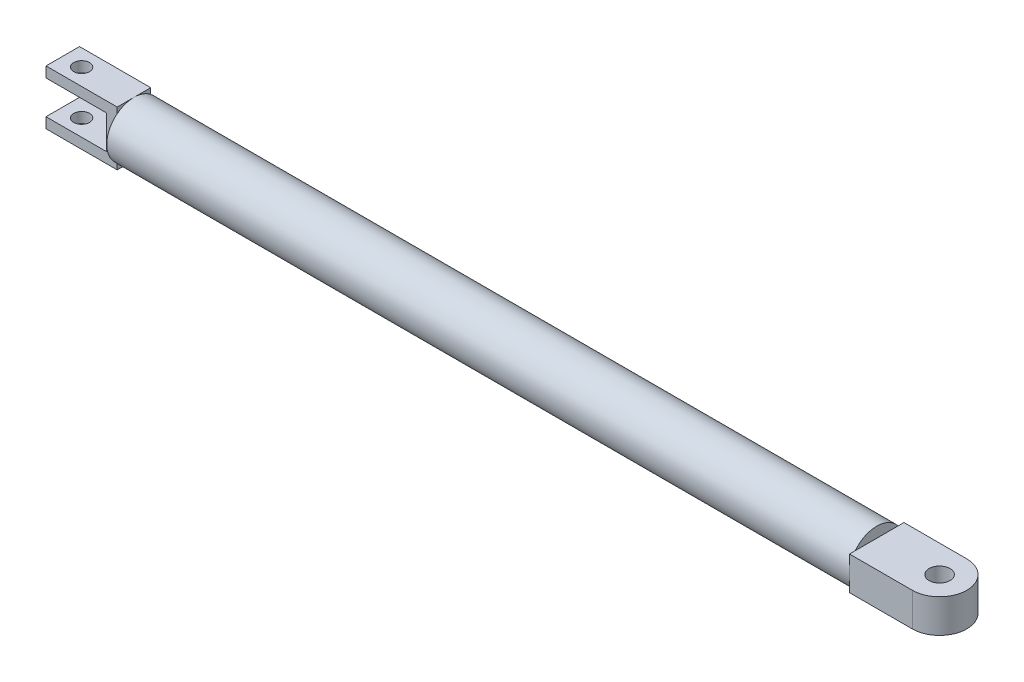
ISO-10303-21;
HEADER;
FILE_DESCRIPTION(('STEP AP214'),'2;1');
FILE_NAME('part.step','',(''),(''),'','','');
FILE_SCHEMA(('AUTOMOTIVE_DESIGN { 1 0 10303 214 1 1 1 1 }'));
ENDSEC;
DATA;
#1=APPLICATION_CONTEXT('core data for automotive mechanical design processes');
#2=APPLICATION_PROTOCOL_DEFINITION('international standard','automotive_design',2000,#1);
#3=PRODUCT_CONTEXT('',#1,'mechanical');
#4=PRODUCT('Part','Part','',(#3));
#5=PRODUCT_RELATED_PRODUCT_CATEGORY('part','',(#4));
#6=PRODUCT_DEFINITION_FORMATION('','',#4);
#7=PRODUCT_DEFINITION_CONTEXT('part definition',#1,'design');
#8=PRODUCT_DEFINITION('design','',#6,#7);
#9=PRODUCT_DEFINITION_SHAPE('','',#8);
#10=(LENGTH_UNIT() NAMED_UNIT(*) SI_UNIT(.MILLI.,.METRE.));
#11=(NAMED_UNIT(*) PLANE_ANGLE_UNIT() SI_UNIT($,.RADIAN.));
#12=(NAMED_UNIT(*) SI_UNIT($,.STERADIAN.) SOLID_ANGLE_UNIT());
#13=UNCERTAINTY_MEASURE_WITH_UNIT(LENGTH_MEASURE(1.E-05),#10,'distance_accuracy_value','');
#14=(GEOMETRIC_REPRESENTATION_CONTEXT(3) GLOBAL_UNCERTAINTY_ASSIGNED_CONTEXT((#13)) GLOBAL_UNIT_ASSIGNED_CONTEXT((#10,
#11,#12)) REPRESENTATION_CONTEXT('',''));
#15=CARTESIAN_POINT('',(0.,0.,0.));
#16=DIRECTION('',(0.,0.,1.));
#17=DIRECTION('',(1.,0.,0.));
#18=AXIS2_PLACEMENT_3D('',#15,#16,#17);
#19=CARTESIAN_POINT('',(0.,0.,0.));
#20=DIRECTION('',(1.,0.,0.));
#21=DIRECTION('',(0.,0.,-1.));
#22=AXIS2_PLACEMENT_3D('',#19,#20,#21);
#23=PLANE('',#22);
#24=DIRECTION('',(0.,-1.,0.));
#25=VECTOR('',#24,1.);
#26=CARTESIAN_POINT('',(0.,0.,-5.08));
#27=LINE('',#26,#25);
#28=CARTESIAN_POINT('',(0.,6.50681373638434,-5.08));
#29=VERTEX_POINT('',#28);
#30=CARTESIAN_POINT('',(0.,-6.50681373638434,-5.08));
#31=VERTEX_POINT('',#30);
#32=EDGE_CURVE('E44',#29,#31,#27,.T.);
#33=ORIENTED_EDGE('',*,*,#32,.F.);
#34=CARTESIAN_POINT('',(0.,0.,0.));
#35=DIRECTION('',(1.,0.,0.));
#36=DIRECTION('',(0.,0.,-1.));
#37=AXIS2_PLACEMENT_3D('',#34,#35,#36);
#38=CIRCLE('',#37,8.255);
#39=EDGE_CURVE('E276',#31,#29,#38,.T.);
#40=ORIENTED_EDGE('',*,*,#39,.F.);
#41=EDGE_LOOP('',(#33,#40));
#42=FACE_BOUND('',#41,.T.);
#43=ADVANCED_FACE('F35',(#42),#23,.F.);
#44=CARTESIAN_POINT('',(225.171,0.,0.));
#45=DIRECTION('',(1.,0.,0.));
#46=DIRECTION('',(0.,0.,-1.));
#47=AXIS2_PLACEMENT_3D('',#44,#45,#46);
#48=PLANE('',#47);
#49=CARTESIAN_POINT('',(225.171,0.,0.));
#50=DIRECTION('',(1.,0.,0.));
#51=DIRECTION('',(0.,0.,-1.));
#52=AXIS2_PLACEMENT_3D('',#49,#50,#51);
#53=CIRCLE('',#52,8.255);
#54=CARTESIAN_POINT('',(225.171,-5.08,6.50681373638434));
#55=VERTEX_POINT('',#54);
#56=CARTESIAN_POINT('',(225.171,-5.08,-6.50681373638434));
#57=VERTEX_POINT('',#56);
#58=EDGE_CURVE('E294',#55,#57,#53,.T.);
#59=ORIENTED_EDGE('',*,*,#58,.T.);
#60=DIRECTION('',(0.,0.,1.));
#61=VECTOR('',#60,1.);
#62=CARTESIAN_POINT('',(225.171,-5.08,8.255));
#63=LINE('',#62,#61);
#64=EDGE_CURVE('E272',#57,#55,#63,.T.);
#65=ORIENTED_EDGE('',*,*,#64,.T.);
#66=EDGE_LOOP('',(#59,#65));
#67=FACE_BOUND('',#66,.T.);
#68=ADVANCED_FACE('F362',(#67),#48,.T.);
#69=CARTESIAN_POINT('',(225.171,0.,0.));
#70=DIRECTION('',(-1.,0.,0.));
#71=DIRECTION('',(0.,0.,1.));
#72=AXIS2_PLACEMENT_3D('',#69,#70,#71);
#73=CYLINDRICAL_SURFACE('',#72,8.255);
#74=CARTESIAN_POINT('',(225.171,0.,-8.255));
#75=VERTEX_POINT('',#74);
#76=CARTESIAN_POINT('',(225.171,5.08,-6.50681373638434));
#77=VERTEX_POINT('',#76);
#78=EDGE_CURVE('E285',#75,#77,#53,.T.);
#79=ORIENTED_EDGE('',*,*,#78,.F.);
#80=EDGE_CURVE('E287',#57,#75,#53,.T.);
#81=ORIENTED_EDGE('',*,*,#80,.F.);
#82=ORIENTED_EDGE('',*,*,#58,.F.);
#83=CARTESIAN_POINT('',(225.171,0.,8.255));
#84=VERTEX_POINT('',#83);
#85=EDGE_CURVE('E356',#84,#55,#53,.T.);
#86=ORIENTED_EDGE('',*,*,#85,.F.);
#87=CARTESIAN_POINT('',(225.171,5.08,6.50681373638434));
#88=VERTEX_POINT('',#87);
#89=EDGE_CURVE('E331',#88,#84,#53,.T.);
#90=ORIENTED_EDGE('',*,*,#89,.F.);
#91=EDGE_CURVE('E286',#77,#88,#53,.T.);
#92=ORIENTED_EDGE('',*,*,#91,.F.);
#93=EDGE_LOOP('',(#79,#81,#82,#86,#90,#92));
#94=FACE_BOUND('',#93,.T.);
#95=CARTESIAN_POINT('',(0.,8.255,0.));
#96=VERTEX_POINT('',#95);
#97=EDGE_CURVE('E288',#29,#96,#38,.T.);
#98=ORIENTED_EDGE('',*,*,#97,.T.);
#99=CARTESIAN_POINT('',(0.,6.50681373638434,5.08));
#100=VERTEX_POINT('',#99);
#101=EDGE_CURVE('E289',#96,#100,#38,.T.);
#102=ORIENTED_EDGE('',*,*,#101,.T.);
#103=CARTESIAN_POINT('',(0.,-6.50681373638434,5.08));
#104=VERTEX_POINT('',#103);
#105=EDGE_CURVE('E295',#100,#104,#38,.T.);
#106=ORIENTED_EDGE('',*,*,#105,.T.);
#107=CARTESIAN_POINT('',(0.,-8.255,0.));
#108=VERTEX_POINT('',#107);
#109=EDGE_CURVE('E54',#104,#108,#38,.T.);
#110=ORIENTED_EDGE('',*,*,#109,.T.);
#111=EDGE_CURVE('E296',#108,#31,#38,.T.);
#112=ORIENTED_EDGE('',*,*,#111,.T.);
#113=ORIENTED_EDGE('',*,*,#39,.T.);
#114=EDGE_LOOP('',(#98,#102,#106,#110,#112,#113));
#115=FACE_BOUND('',#114,.T.);
#116=ADVANCED_FACE('F37',(#94,#115),#73,.T.);
#117=DIRECTION('',(0.,0.,1.));
#118=VECTOR('',#117,1.);
#119=CARTESIAN_POINT('',(225.171,5.08,8.255));
#120=LINE('',#119,#118);
#121=EDGE_CURVE('E255',#77,#88,#120,.T.);
#122=ORIENTED_EDGE('',*,*,#121,.F.);
#123=ORIENTED_EDGE('',*,*,#91,.T.);
#124=EDGE_LOOP('',(#122,#123));
#125=FACE_BOUND('',#124,.T.);
#126=ADVANCED_FACE('F352',(#125),#48,.T.);
#127=ORIENTED_EDGE('',*,*,#105,.F.);
#128=DIRECTION('',(0.,-1.,0.));
#129=VECTOR('',#128,1.);
#130=CARTESIAN_POINT('',(0.,0.,5.08));
#131=LINE('',#130,#129);
#132=EDGE_CURVE('E11',#100,#104,#131,.T.);
#133=ORIENTED_EDGE('',*,*,#132,.T.);
#134=EDGE_LOOP('',(#127,#133));
#135=FACE_BOUND('',#134,.T.);
#136=ADVANCED_FACE('F375',(#135),#23,.F.);
#137=CARTESIAN_POINT('',(225.171,-5.08,8.255));
#138=DIRECTION('',(-1.,0.,0.));
#139=DIRECTION('',(0.,0.,1.));
#140=AXIS2_PLACEMENT_3D('',#137,#138,#139);
#141=PLANE('',#140);
#142=CARTESIAN_POINT('',(225.171,5.08,8.255));
#143=VERTEX_POINT('',#142);
#144=EDGE_CURVE('E250',#88,#143,#120,.T.);
#145=ORIENTED_EDGE('',*,*,#144,.F.);
#146=ORIENTED_EDGE('',*,*,#89,.T.);
#147=DIRECTION('',(0.,1.,0.));
#148=VECTOR('',#147,1.);
#149=CARTESIAN_POINT('',(225.171,-5.08,8.255));
#150=LINE('',#149,#148);
#151=EDGE_CURVE('E277',#84,#143,#150,.T.);
#152=ORIENTED_EDGE('',*,*,#151,.T.);
#153=EDGE_LOOP('',(#145,#146,#152));
#154=FACE_BOUND('',#153,.T.);
#155=ADVANCED_FACE('F330',(#154),#141,.T.);
#156=CARTESIAN_POINT('',(225.171,-5.08,8.255));
#157=VERTEX_POINT('',#156);
#158=EDGE_CURVE('E273',#157,#84,#150,.T.);
#159=ORIENTED_EDGE('',*,*,#158,.T.);
#160=ORIENTED_EDGE('',*,*,#85,.T.);
#161=EDGE_CURVE('E267',#55,#157,#63,.T.);
#162=ORIENTED_EDGE('',*,*,#161,.T.);
#163=EDGE_LOOP('',(#159,#160,#162));
#164=FACE_BOUND('',#163,.T.);
#165=ADVANCED_FACE('F368',(#164),#141,.T.);
#166=DIRECTION('',(0.,1.,0.));
#167=VECTOR('',#166,1.);
#168=CARTESIAN_POINT('',(225.171,-5.08,-8.255));
#169=LINE('',#168,#167);
#170=CARTESIAN_POINT('',(225.171,5.08,-8.255));
#171=VERTEX_POINT('',#170);
#172=EDGE_CURVE('E281',#75,#171,#169,.T.);
#173=ORIENTED_EDGE('',*,*,#172,.F.);
#174=ORIENTED_EDGE('',*,*,#78,.T.);
#175=EDGE_CURVE('E251',#171,#77,#120,.T.);
#176=ORIENTED_EDGE('',*,*,#175,.F.);
#177=EDGE_LOOP('',(#173,#174,#176));
#178=FACE_BOUND('',#177,.T.);
#179=ADVANCED_FACE('F348',(#178),#141,.T.);
#180=CARTESIAN_POINT('',(225.171,-5.08,8.255));
#181=DIRECTION('',(0.,0.,1.));
#182=DIRECTION('',(1.,0.,0.));
#183=AXIS2_PLACEMENT_3D('',#180,#181,#182);
#184=PLANE('',#183);
#185=DIRECTION('',(0.,1.,0.));
#186=VECTOR('',#185,1.);
#187=CARTESIAN_POINT('',(244.221,-5.08,8.255));
#188=LINE('',#187,#186);
#189=CARTESIAN_POINT('',(244.221,-5.08,8.255));
#190=VERTEX_POINT('',#189);
#191=CARTESIAN_POINT('',(244.221,5.08,8.255));
#192=VERTEX_POINT('',#191);
#193=EDGE_CURVE('E271',#190,#192,#188,.T.);
#194=ORIENTED_EDGE('',*,*,#193,.T.);
#195=DIRECTION('',(1.,0.,0.));
#196=VECTOR('',#195,1.);
#197=CARTESIAN_POINT('',(225.171,5.08,8.255));
#198=LINE('',#197,#196);
#199=EDGE_CURVE('E241',#143,#192,#198,.T.);
#200=ORIENTED_EDGE('',*,*,#199,.F.);
#201=ORIENTED_EDGE('',*,*,#151,.F.);
#202=ORIENTED_EDGE('',*,*,#158,.F.);
#203=DIRECTION('',(1.,0.,0.));
#204=VECTOR('',#203,1.);
#205=CARTESIAN_POINT('',(225.171,-5.08,8.255));
#206=LINE('',#205,#204);
#207=EDGE_CURVE('E258',#157,#190,#206,.T.);
#208=ORIENTED_EDGE('',*,*,#207,.T.);
#209=EDGE_LOOP('',(#194,#200,#201,#202,#208));
#210=FACE_BOUND('',#209,.T.);
#211=ADVANCED_FACE('F334',(#210),#184,.T.);
#212=CARTESIAN_POINT('',(225.171,-5.08,-8.255));
#213=VERTEX_POINT('',#212);
#214=EDGE_CURVE('E268',#213,#57,#63,.T.);
#215=ORIENTED_EDGE('',*,*,#214,.T.);
#216=ORIENTED_EDGE('',*,*,#80,.T.);
#217=EDGE_CURVE('E278',#213,#75,#169,.T.);
#218=ORIENTED_EDGE('',*,*,#217,.F.);
#219=EDGE_LOOP('',(#215,#216,#218));
#220=FACE_BOUND('',#219,.T.);
#221=ADVANCED_FACE('F364',(#220),#141,.T.);
#222=CARTESIAN_POINT('',(225.171,-5.08,-8.255));
#223=DIRECTION('',(0.,0.,-1.));
#224=DIRECTION('',(-1.,0.,0.));
#225=AXIS2_PLACEMENT_3D('',#222,#223,#224);
#226=PLANE('',#225);
#227=ORIENTED_EDGE('',*,*,#217,.T.);
#228=ORIENTED_EDGE('',*,*,#172,.T.);
#229=DIRECTION('',(-1.,0.,0.));
#230=VECTOR('',#229,1.);
#231=CARTESIAN_POINT('',(225.171,5.08,-8.255));
#232=LINE('',#231,#230);
#233=CARTESIAN_POINT('',(244.221,5.08,-8.255));
#234=VERTEX_POINT('',#233);
#235=EDGE_CURVE('E247',#234,#171,#232,.T.);
#236=ORIENTED_EDGE('',*,*,#235,.F.);
#237=DIRECTION('',(0.,1.,0.));
#238=VECTOR('',#237,1.);
#239=CARTESIAN_POINT('',(244.221,-5.08,-8.255));
#240=LINE('',#239,#238);
#241=CARTESIAN_POINT('',(244.221,-5.08,-8.255));
#242=VERTEX_POINT('',#241);
#243=EDGE_CURVE('E282',#242,#234,#240,.T.);
#244=ORIENTED_EDGE('',*,*,#243,.F.);
#245=DIRECTION('',(-1.,0.,0.));
#246=VECTOR('',#245,1.);
#247=CARTESIAN_POINT('',(225.171,-5.08,-8.255));
#248=LINE('',#247,#246);
#249=EDGE_CURVE('E264',#242,#213,#248,.T.);
#250=ORIENTED_EDGE('',*,*,#249,.T.);
#251=EDGE_LOOP('',(#227,#228,#236,#244,#250));
#252=FACE_BOUND('',#251,.T.);
#253=ADVANCED_FACE('F343',(#252),#226,.T.);
#254=CARTESIAN_POINT('',(244.221,-5.08,0.));
#255=DIRECTION('',(0.,1.,0.));
#256=DIRECTION('',(0.,0.,1.));
#257=AXIS2_PLACEMENT_3D('',#254,#255,#256);
#258=CYLINDRICAL_SURFACE('',#257,8.255);
#259=ORIENTED_EDGE('',*,*,#243,.T.);
#260=CARTESIAN_POINT('',(244.221,5.08,0.));
#261=DIRECTION('',(0.,1.,0.));
#262=DIRECTION('',(0.,0.,-1.));
#263=AXIS2_PLACEMENT_3D('',#260,#261,#262);
#264=CIRCLE('',#263,8.255);
#265=EDGE_CURVE('E244',#192,#234,#264,.T.);
#266=ORIENTED_EDGE('',*,*,#265,.F.);
#267=ORIENTED_EDGE('',*,*,#193,.F.);
#268=CARTESIAN_POINT('',(244.221,-5.08,0.));
#269=DIRECTION('',(0.,1.,0.));
#270=DIRECTION('',(0.,0.,-1.));
#271=AXIS2_PLACEMENT_3D('',#268,#269,#270);
#272=CIRCLE('',#271,8.255);
#273=EDGE_CURVE('E261',#190,#242,#272,.T.);
#274=ORIENTED_EDGE('',*,*,#273,.T.);
#275=EDGE_LOOP('',(#259,#266,#267,#274));
#276=FACE_BOUND('',#275,.T.);
#277=ADVANCED_FACE('F339',(#276),#258,.T.);
#278=CARTESIAN_POINT('',(244.221,-5.08,0.));
#279=DIRECTION('',(0.,-1.,0.));
#280=DIRECTION('',(0.,0.,-1.));
#281=AXIS2_PLACEMENT_3D('',#278,#279,#280);
#282=PLANE('',#281);
#283=CARTESIAN_POINT('',(244.221,-5.08,0.));
#284=DIRECTION('',(0.,1.,0.));
#285=DIRECTION('',(0.,0.,1.));
#286=AXIS2_PLACEMENT_3D('',#283,#284,#285);
#287=CIRCLE('',#286,3.17499999999997);
#288=CARTESIAN_POINT('',(244.221,-5.08,3.17499999999997));
#289=VERTEX_POINT('',#288);
#290=EDGE_CURVE('E254',#289,#289,#287,.T.);
#291=ORIENTED_EDGE('',*,*,#290,.T.);
#292=EDGE_LOOP('',(#291));
#293=FACE_BOUND('',#292,.T.);
#294=ORIENTED_EDGE('',*,*,#207,.F.);
#295=ORIENTED_EDGE('',*,*,#161,.F.);
#296=ORIENTED_EDGE('',*,*,#64,.F.);
#297=ORIENTED_EDGE('',*,*,#214,.F.);
#298=ORIENTED_EDGE('',*,*,#249,.F.);
#299=ORIENTED_EDGE('',*,*,#273,.F.);
#300=EDGE_LOOP('',(#294,#295,#296,#297,#298,#299));
#301=FACE_BOUND('',#300,.T.);
#302=ADVANCED_FACE('F367',(#293,#301),#282,.T.);
#303=CARTESIAN_POINT('',(244.221,-5.08,0.));
#304=DIRECTION('',(0.,1.,0.));
#305=DIRECTION('',(0.,0.,1.));
#306=AXIS2_PLACEMENT_3D('',#303,#304,#305);
#307=CYLINDRICAL_SURFACE('',#306,3.17499999999997);
#308=ORIENTED_EDGE('',*,*,#290,.F.);
#309=EDGE_LOOP('',(#308));
#310=FACE_BOUND('',#309,.T.);
#311=CARTESIAN_POINT('',(244.221,5.08,0.));
#312=DIRECTION('',(0.,1.,0.));
#313=DIRECTION('',(0.,0.,1.));
#314=AXIS2_PLACEMENT_3D('',#311,#312,#313);
#315=CIRCLE('',#314,3.17499999999997);
#316=CARTESIAN_POINT('',(244.221,5.08,3.17499999999997));
#317=VERTEX_POINT('',#316);
#318=EDGE_CURVE('E223',#317,#317,#315,.T.);
#319=ORIENTED_EDGE('',*,*,#318,.T.);
#320=EDGE_LOOP('',(#319));
#321=FACE_BOUND('',#320,.T.);
#322=ADVANCED_FACE('F583',(#310,#321),#307,.F.);
#323=CARTESIAN_POINT('',(244.221,5.08,0.));
#324=DIRECTION('',(0.,-1.,0.));
#325=DIRECTION('',(0.,0.,-1.));
#326=AXIS2_PLACEMENT_3D('',#323,#324,#325);
#327=PLANE('',#326);
#328=ORIENTED_EDGE('',*,*,#199,.T.);
#329=ORIENTED_EDGE('',*,*,#265,.T.);
#330=ORIENTED_EDGE('',*,*,#235,.T.);
#331=ORIENTED_EDGE('',*,*,#175,.T.);
#332=ORIENTED_EDGE('',*,*,#121,.T.);
#333=ORIENTED_EDGE('',*,*,#144,.T.);
#334=EDGE_LOOP('',(#328,#329,#330,#331,#332,#333));
#335=FACE_BOUND('',#334,.T.);
#336=ORIENTED_EDGE('',*,*,#318,.F.);
#337=EDGE_LOOP('',(#336));
#338=FACE_BOUND('',#337,.T.);
#339=ADVANCED_FACE('F325',(#335,#338),#327,.F.);
#340=CARTESIAN_POINT('',(0.,0.,-5.08));
#341=DIRECTION('',(-1.,0.,0.));
#342=DIRECTION('',(0.,0.,1.));
#343=AXIS2_PLACEMENT_3D('',#340,#341,#342);
#344=PLANE('',#343);
#345=ORIENTED_EDGE('',*,*,#97,.F.);
#346=CARTESIAN_POINT('',(0.,8.255,-5.08));
#347=VERTEX_POINT('',#346);
#348=EDGE_CURVE('E214',#347,#29,#27,.T.);
#349=ORIENTED_EDGE('',*,*,#348,.F.);
#350=DIRECTION('',(0.,0.,1.));
#351=VECTOR('',#350,1.);
#352=CARTESIAN_POINT('',(0.,8.255,-5.08));
#353=LINE('',#352,#351);
#354=EDGE_CURVE('E228',#347,#96,#353,.T.);
#355=ORIENTED_EDGE('',*,*,#354,.T.);
#356=EDGE_LOOP('',(#345,#349,#355));
#357=FACE_BOUND('',#356,.T.);
#358=ADVANCED_FACE('F446',(#357),#344,.F.);
#359=ORIENTED_EDGE('',*,*,#101,.F.);
#360=CARTESIAN_POINT('',(0.,8.255,5.08));
#361=VERTEX_POINT('',#360);
#362=EDGE_CURVE('E231',#96,#361,#353,.T.);
#363=ORIENTED_EDGE('',*,*,#362,.T.);
#364=EDGE_CURVE('E46',#361,#100,#131,.T.);
#365=ORIENTED_EDGE('',*,*,#364,.T.);
#366=EDGE_LOOP('',(#359,#363,#365));
#367=FACE_BOUND('',#366,.T.);
#368=ADVANCED_FACE('F451',(#367),#344,.F.);
#369=ORIENTED_EDGE('',*,*,#109,.F.);
#370=CARTESIAN_POINT('',(0.,-8.255,5.08));
#371=VERTEX_POINT('',#370);
#372=EDGE_CURVE('E47',#104,#371,#131,.T.);
#373=ORIENTED_EDGE('',*,*,#372,.T.);
#374=DIRECTION('',(0.,0.,1.));
#375=VECTOR('',#374,1.);
#376=CARTESIAN_POINT('',(0.,-8.255,-5.08));
#377=LINE('',#376,#375);
#378=EDGE_CURVE('E235',#108,#371,#377,.T.);
#379=ORIENTED_EDGE('',*,*,#378,.F.);
#380=EDGE_LOOP('',(#369,#373,#379));
#381=FACE_BOUND('',#380,.T.);
#382=ADVANCED_FACE('F302',(#381),#344,.F.);
#383=CARTESIAN_POINT('',(-3.175,0.,-5.08));
#384=DIRECTION('',(-1.,0.,0.));
#385=DIRECTION('',(0.,-1.,0.));
#386=AXIS2_PLACEMENT_3D('',#383,#384,#385);
#387=PLANE('',#386);
#388=DIRECTION('',(0.,0.,1.));
#389=VECTOR('',#388,1.);
#390=CARTESIAN_POINT('',(-3.175,-5.07999999999999,-5.08));
#391=LINE('',#390,#389);
#392=CARTESIAN_POINT('',(-3.175,-5.07999999999999,-5.08));
#393=VERTEX_POINT('',#392);
#394=CARTESIAN_POINT('',(-3.175,-5.07999999999999,5.08));
#395=VERTEX_POINT('',#394);
#396=EDGE_CURVE('E162',#393,#395,#391,.T.);
#397=ORIENTED_EDGE('',*,*,#396,.T.);
#398=DIRECTION('',(0.,-1.,0.));
#399=VECTOR('',#398,1.);
#400=CARTESIAN_POINT('',(-3.175,0.,5.08));
#401=LINE('',#400,#399);
#402=CARTESIAN_POINT('',(-3.175,5.08,5.08));
#403=VERTEX_POINT('',#402);
#404=EDGE_CURVE('E166',#403,#395,#401,.T.);
#405=ORIENTED_EDGE('',*,*,#404,.F.);
#406=DIRECTION('',(0.,0.,1.));
#407=VECTOR('',#406,1.);
#408=CARTESIAN_POINT('',(-3.175,5.08,-5.08));
#409=LINE('',#408,#407);
#410=CARTESIAN_POINT('',(-3.175,5.08,-5.08));
#411=VERTEX_POINT('',#410);
#412=EDGE_CURVE('E221',#411,#403,#409,.T.);
#413=ORIENTED_EDGE('',*,*,#412,.F.);
#414=DIRECTION('',(0.,-1.,0.));
#415=VECTOR('',#414,1.);
#416=CARTESIAN_POINT('',(-3.175,0.,-5.08));
#417=LINE('',#416,#415);
#418=EDGE_CURVE('E169',#411,#393,#417,.T.);
#419=ORIENTED_EDGE('',*,*,#418,.T.);
#420=EDGE_LOOP('',(#397,#405,#413,#419));
#421=FACE_BOUND('',#420,.T.);
#422=ADVANCED_FACE('F164',(#421),#387,.T.);
#423=CARTESIAN_POINT('',(0.,5.08,-5.08));
#424=DIRECTION('',(0.,1.,0.));
#425=DIRECTION('',(-1.,0.,0.));
#426=AXIS2_PLACEMENT_3D('',#423,#424,#425);
#427=PLANE('',#426);
#428=CARTESIAN_POINT('',(-15.875,5.08,0.));
#429=DIRECTION('',(0.,1.,0.));
#430=DIRECTION('',(-1.,0.,0.));
#431=AXIS2_PLACEMENT_3D('',#428,#429,#430);
#432=CIRCLE('',#431,2.39825496759705);
#433=CARTESIAN_POINT('',(-18.2732549675971,5.08,0.));
#434=VERTEX_POINT('',#433);
#435=EDGE_CURVE('E188',#434,#434,#432,.T.);
#436=ORIENTED_EDGE('',*,*,#435,.T.);
#437=EDGE_LOOP('',(#436));
#438=FACE_BOUND('',#437,.T.);
#439=ORIENTED_EDGE('',*,*,#412,.T.);
#440=DIRECTION('',(-1.,0.,0.));
#441=VECTOR('',#440,1.);
#442=CARTESIAN_POINT('',(0.,5.08,5.08));
#443=LINE('',#442,#441);
#444=CARTESIAN_POINT('',(-21.59,5.08,5.08));
#445=VERTEX_POINT('',#444);
#446=EDGE_CURVE('E187',#403,#445,#443,.T.);
#447=ORIENTED_EDGE('',*,*,#446,.T.);
#448=DIRECTION('',(0.,0.,1.));
#449=VECTOR('',#448,1.);
#450=CARTESIAN_POINT('',(-21.59,5.08,-5.08));
#451=LINE('',#450,#449);
#452=CARTESIAN_POINT('',(-21.59,5.08,-5.08));
#453=VERTEX_POINT('',#452);
#454=EDGE_CURVE('E224',#453,#445,#451,.T.);
#455=ORIENTED_EDGE('',*,*,#454,.F.);
#456=DIRECTION('',(-1.,0.,0.));
#457=VECTOR('',#456,1.);
#458=CARTESIAN_POINT('',(0.,5.08,-5.08));
#459=LINE('',#458,#457);
#460=EDGE_CURVE('E174',#411,#453,#459,.T.);
#461=ORIENTED_EDGE('',*,*,#460,.F.);
#462=EDGE_LOOP('',(#439,#447,#455,#461));
#463=FACE_BOUND('',#462,.T.);
#464=ADVANCED_FACE('F477',(#438,#463),#427,.F.);
#465=CARTESIAN_POINT('',(-21.59,0.,-5.08));
#466=DIRECTION('',(-1.,0.,0.));
#467=DIRECTION('',(0.,-1.,0.));
#468=AXIS2_PLACEMENT_3D('',#465,#466,#467);
#469=PLANE('',#468);
#470=ORIENTED_EDGE('',*,*,#454,.T.);
#471=DIRECTION('',(0.,-1.,0.));
#472=VECTOR('',#471,1.);
#473=CARTESIAN_POINT('',(-21.59,0.,5.08));
#474=LINE('',#473,#472);
#475=CARTESIAN_POINT('',(-21.59,8.255,5.08));
#476=VERTEX_POINT('',#475);
#477=EDGE_CURVE('E196',#476,#445,#474,.T.);
#478=ORIENTED_EDGE('',*,*,#477,.F.);
#479=DIRECTION('',(0.,0.,1.));
#480=VECTOR('',#479,1.);
#481=CARTESIAN_POINT('',(-21.59,8.255,-5.08));
#482=LINE('',#481,#480);
#483=CARTESIAN_POINT('',(-21.59,8.255,-5.08));
#484=VERTEX_POINT('',#483);
#485=EDGE_CURVE('E226',#484,#476,#482,.T.);
#486=ORIENTED_EDGE('',*,*,#485,.F.);
#487=DIRECTION('',(0.,-1.,0.));
#488=VECTOR('',#487,1.);
#489=CARTESIAN_POINT('',(-21.59,0.,-5.08));
#490=LINE('',#489,#488);
#491=EDGE_CURVE('E211',#484,#453,#490,.T.);
#492=ORIENTED_EDGE('',*,*,#491,.T.);
#493=EDGE_LOOP('',(#470,#478,#486,#492));
#494=FACE_BOUND('',#493,.T.);
#495=ADVANCED_FACE('F484',(#494),#469,.T.);
#496=CARTESIAN_POINT('',(0.,8.255,-5.08));
#497=DIRECTION('',(0.,1.,0.));
#498=DIRECTION('',(-1.,0.,0.));
#499=AXIS2_PLACEMENT_3D('',#496,#497,#498);
#500=PLANE('',#499);
#501=CARTESIAN_POINT('',(-15.875,8.255,0.));
#502=DIRECTION('',(0.,1.,0.));
#503=DIRECTION('',(-1.,0.,0.));
#504=AXIS2_PLACEMENT_3D('',#501,#502,#503);
#505=CIRCLE('',#504,2.39825496759705);
#506=CARTESIAN_POINT('',(-18.2732549675971,8.255,0.));
#507=VERTEX_POINT('',#506);
#508=EDGE_CURVE('E625',#507,#507,#505,.T.);
#509=ORIENTED_EDGE('',*,*,#508,.F.);
#510=EDGE_LOOP('',(#509));
#511=FACE_BOUND('',#510,.T.);
#512=ORIENTED_EDGE('',*,*,#485,.T.);
#513=DIRECTION('',(-1.,0.,0.));
#514=VECTOR('',#513,1.);
#515=CARTESIAN_POINT('',(0.,8.255,5.08));
#516=LINE('',#515,#514);
#517=EDGE_CURVE('E200',#361,#476,#516,.T.);
#518=ORIENTED_EDGE('',*,*,#517,.F.);
#519=ORIENTED_EDGE('',*,*,#362,.F.);
#520=ORIENTED_EDGE('',*,*,#354,.F.);
#521=DIRECTION('',(-1.,0.,0.));
#522=VECTOR('',#521,1.);
#523=CARTESIAN_POINT('',(0.,8.255,-5.08));
#524=LINE('',#523,#522);
#525=EDGE_CURVE('E217',#347,#484,#524,.T.);
#526=ORIENTED_EDGE('',*,*,#525,.T.);
#527=EDGE_LOOP('',(#512,#518,#519,#520,#526));
#528=FACE_BOUND('',#527,.T.);
#529=ADVANCED_FACE('F489',(#511,#528),#500,.T.);
#530=ORIENTED_EDGE('',*,*,#111,.F.);
#531=CARTESIAN_POINT('',(0.,-8.255,-5.08));
#532=VERTEX_POINT('',#531);
#533=EDGE_CURVE('E232',#532,#108,#377,.T.);
#534=ORIENTED_EDGE('',*,*,#533,.F.);
#535=EDGE_CURVE('E213',#31,#532,#27,.T.);
#536=ORIENTED_EDGE('',*,*,#535,.F.);
#537=EDGE_LOOP('',(#530,#534,#536));
#538=FACE_BOUND('',#537,.T.);
#539=ADVANCED_FACE('F312',(#538),#344,.F.);
#540=CARTESIAN_POINT('',(0.,-8.255,-5.08));
#541=DIRECTION('',(0.,1.,0.));
#542=DIRECTION('',(-1.,0.,0.));
#543=AXIS2_PLACEMENT_3D('',#540,#541,#542);
#544=PLANE('',#543);
#545=CARTESIAN_POINT('',(-15.875,-8.25500000000013,0.));
#546=DIRECTION('',(0.,1.,0.));
#547=DIRECTION('',(-1.,0.,0.));
#548=AXIS2_PLACEMENT_3D('',#545,#546,#547);
#549=CIRCLE('',#548,2.39825496759705);
#550=CARTESIAN_POINT('',(-18.273254967597,-8.25500000000013,0.));
#551=VERTEX_POINT('',#550);
#552=EDGE_CURVE('E637',#551,#551,#549,.T.);
#553=ORIENTED_EDGE('',*,*,#552,.T.);
#554=EDGE_LOOP('',(#553));
#555=FACE_BOUND('',#554,.T.);
#556=ORIENTED_EDGE('',*,*,#533,.T.);
#557=ORIENTED_EDGE('',*,*,#378,.T.);
#558=DIRECTION('',(-1.,0.,0.));
#559=VECTOR('',#558,1.);
#560=CARTESIAN_POINT('',(0.,-8.255,5.08));
#561=LINE('',#560,#559);
#562=CARTESIAN_POINT('',(-21.59,-8.255,5.08));
#563=VERTEX_POINT('',#562);
#564=EDGE_CURVE('E195',#371,#563,#561,.T.);
#565=ORIENTED_EDGE('',*,*,#564,.T.);
#566=DIRECTION('',(0.,0.,1.));
#567=VECTOR('',#566,1.);
#568=CARTESIAN_POINT('',(-21.59,-8.255,-5.08));
#569=LINE('',#568,#567);
#570=CARTESIAN_POINT('',(-21.59,-8.255,-5.08));
#571=VERTEX_POINT('',#570);
#572=EDGE_CURVE('E236',#571,#563,#569,.T.);
#573=ORIENTED_EDGE('',*,*,#572,.F.);
#574=DIRECTION('',(-1.,0.,0.));
#575=VECTOR('',#574,1.);
#576=CARTESIAN_POINT('',(0.,-8.255,-5.08));
#577=LINE('',#576,#575);
#578=EDGE_CURVE('E210',#532,#571,#577,.T.);
#579=ORIENTED_EDGE('',*,*,#578,.F.);
#580=EDGE_LOOP('',(#556,#557,#565,#573,#579));
#581=FACE_BOUND('',#580,.T.);
#582=ADVANCED_FACE('F307',(#555,#581),#544,.F.);
#583=ORIENTED_EDGE('',*,*,#572,.T.);
#584=CARTESIAN_POINT('',(-21.59,-5.07999999999999,5.08));
#585=VERTEX_POINT('',#584);
#586=EDGE_CURVE('E182',#585,#563,#474,.T.);
#587=ORIENTED_EDGE('',*,*,#586,.F.);
#588=DIRECTION('',(0.,0.,1.));
#589=VECTOR('',#588,1.);
#590=CARTESIAN_POINT('',(-21.59,-5.07999999999999,-5.08));
#591=LINE('',#590,#589);
#592=CARTESIAN_POINT('',(-21.59,-5.07999999999999,-5.08));
#593=VERTEX_POINT('',#592);
#594=EDGE_CURVE('E173',#593,#585,#591,.T.);
#595=ORIENTED_EDGE('',*,*,#594,.F.);
#596=EDGE_CURVE('E207',#593,#571,#490,.T.);
#597=ORIENTED_EDGE('',*,*,#596,.T.);
#598=EDGE_LOOP('',(#583,#587,#595,#597));
#599=FACE_BOUND('',#598,.T.);
#600=ADVANCED_FACE('F492',(#599),#469,.T.);
#601=CARTESIAN_POINT('',(0.,-5.07999999999999,-5.08));
#602=DIRECTION('',(0.,1.,0.));
#603=DIRECTION('',(-1.,0.,0.));
#604=AXIS2_PLACEMENT_3D('',#601,#602,#603);
#605=PLANE('',#604);
#606=CARTESIAN_POINT('',(-15.875,-5.08,0.));
#607=DIRECTION('',(0.,1.,0.));
#608=DIRECTION('',(-1.,0.,0.));
#609=AXIS2_PLACEMENT_3D('',#606,#607,#608);
#610=CIRCLE('',#609,2.39825496759705);
#611=CARTESIAN_POINT('',(-18.273254967597,-5.08,0.));
#612=VERTEX_POINT('',#611);
#613=EDGE_CURVE('E39',#612,#612,#610,.T.);
#614=ORIENTED_EDGE('',*,*,#613,.F.);
#615=EDGE_LOOP('',(#614));
#616=FACE_BOUND('',#615,.T.);
#617=ORIENTED_EDGE('',*,*,#594,.T.);
#618=DIRECTION('',(-1.,0.,0.));
#619=VECTOR('',#618,1.);
#620=CARTESIAN_POINT('',(0.,-5.07999999999999,5.08));
#621=LINE('',#620,#619);
#622=EDGE_CURVE('E177',#395,#585,#621,.T.);
#623=ORIENTED_EDGE('',*,*,#622,.F.);
#624=ORIENTED_EDGE('',*,*,#396,.F.);
#625=DIRECTION('',(-1.,0.,0.));
#626=VECTOR('',#625,1.);
#627=CARTESIAN_POINT('',(0.,-5.07999999999999,-5.08));
#628=LINE('',#627,#626);
#629=EDGE_CURVE('E205',#393,#593,#628,.T.);
#630=ORIENTED_EDGE('',*,*,#629,.T.);
#631=EDGE_LOOP('',(#617,#623,#624,#630));
#632=FACE_BOUND('',#631,.T.);
#633=ADVANCED_FACE('F178',(#616,#632),#605,.T.);
#634=CARTESIAN_POINT('',(0.,0.,-5.08));
#635=DIRECTION('',(0.,0.,1.));
#636=DIRECTION('',(1.,0.,0.));
#637=AXIS2_PLACEMENT_3D('',#634,#635,#636);
#638=PLANE('',#637);
#639=ORIENTED_EDGE('',*,*,#418,.F.);
#640=ORIENTED_EDGE('',*,*,#460,.T.);
#641=ORIENTED_EDGE('',*,*,#491,.F.);
#642=ORIENTED_EDGE('',*,*,#525,.F.);
#643=ORIENTED_EDGE('',*,*,#348,.T.);
#644=ORIENTED_EDGE('',*,*,#32,.T.);
#645=ORIENTED_EDGE('',*,*,#535,.T.);
#646=ORIENTED_EDGE('',*,*,#578,.T.);
#647=ORIENTED_EDGE('',*,*,#596,.F.);
#648=ORIENTED_EDGE('',*,*,#629,.F.);
#649=EDGE_LOOP('',(#639,#640,#641,#642,#643,#644,#645,#646,#647,#648));
#650=FACE_BOUND('',#649,.T.);
#651=ADVANCED_FACE('F315',(#650),#638,.F.);
#652=CARTESIAN_POINT('',(0.,0.,5.08));
#653=DIRECTION('',(0.,0.,1.));
#654=DIRECTION('',(1.,0.,0.));
#655=AXIS2_PLACEMENT_3D('',#652,#653,#654);
#656=PLANE('',#655);
#657=ORIENTED_EDGE('',*,*,#404,.T.);
#658=ORIENTED_EDGE('',*,*,#622,.T.);
#659=ORIENTED_EDGE('',*,*,#586,.T.);
#660=ORIENTED_EDGE('',*,*,#564,.F.);
#661=ORIENTED_EDGE('',*,*,#372,.F.);
#662=ORIENTED_EDGE('',*,*,#132,.F.);
#663=ORIENTED_EDGE('',*,*,#364,.F.);
#664=ORIENTED_EDGE('',*,*,#517,.T.);
#665=ORIENTED_EDGE('',*,*,#477,.T.);
#666=ORIENTED_EDGE('',*,*,#446,.F.);
#667=EDGE_LOOP('',(#657,#658,#659,#660,#661,#662,#663,#664,#665,#666));
#668=FACE_BOUND('',#667,.T.);
#669=ADVANCED_FACE('F184',(#668),#656,.T.);
#670=CARTESIAN_POINT('',(-15.875,-8.25500000000013,0.));
#671=DIRECTION('',(0.,1.,0.));
#672=DIRECTION('',(-1.,0.,0.));
#673=AXIS2_PLACEMENT_3D('',#670,#671,#672);
#674=CYLINDRICAL_SURFACE('',#673,2.39825496759705);
#675=ORIENTED_EDGE('',*,*,#613,.T.);
#676=EDGE_LOOP('',(#675));
#677=FACE_BOUND('',#676,.T.);
#678=ORIENTED_EDGE('',*,*,#552,.F.);
#679=EDGE_LOOP('',(#678));
#680=FACE_BOUND('',#679,.T.);
#681=ADVANCED_FACE('F529',(#677,#680),#674,.F.);
#682=ORIENTED_EDGE('',*,*,#508,.T.);
#683=EDGE_LOOP('',(#682));
#684=FACE_BOUND('',#683,.T.);
#685=ORIENTED_EDGE('',*,*,#435,.F.);
#686=EDGE_LOOP('',(#685));
#687=FACE_BOUND('',#686,.T.);
#688=ADVANCED_FACE('F566',(#684,#687),#674,.F.);
#689=CLOSED_SHELL('',(#43,#68,#116,#126,#136,#155,#165,#179,#211,#221,#253,#277,#302,#322,#339,
#358,#368,#382,#422,#464,#495,#529,#539,#582,#600,#633,#651,#669,#681,#688));
#690=MANIFOLD_SOLID_BREP('B2',#689);
#691=ADVANCED_BREP_SHAPE_REPRESENTATION('',(#18,#690),#14);
#692=SHAPE_DEFINITION_REPRESENTATION(#9,#691);
ENDSEC;
END-ISO-10303-21;
